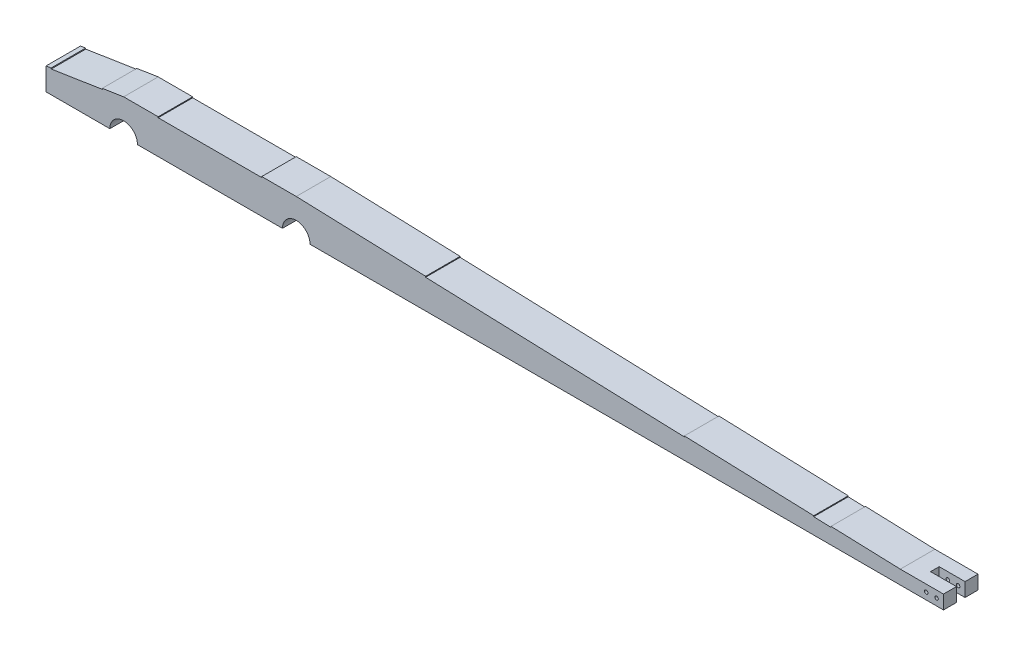
ISO-10303-21;
HEADER;
FILE_DESCRIPTION(('STEP AP214'),'2;1');
FILE_NAME('part.step','',(''),(''),'','','');
FILE_SCHEMA(('AUTOMOTIVE_DESIGN { 1 0 10303 214 1 1 1 1 }'));
ENDSEC;
DATA;
#1=APPLICATION_CONTEXT('core data for automotive mechanical design processes');
#2=APPLICATION_PROTOCOL_DEFINITION('international standard','automotive_design',2000,#1);
#3=PRODUCT_CONTEXT('',#1,'mechanical');
#4=PRODUCT('Part','Part','',(#3));
#5=PRODUCT_RELATED_PRODUCT_CATEGORY('part','',(#4));
#6=PRODUCT_DEFINITION_FORMATION('','',#4);
#7=PRODUCT_DEFINITION_CONTEXT('part definition',#1,'design');
#8=PRODUCT_DEFINITION('design','',#6,#7);
#9=PRODUCT_DEFINITION_SHAPE('','',#8);
#10=(LENGTH_UNIT() NAMED_UNIT(*) SI_UNIT(.MILLI.,.METRE.));
#11=(NAMED_UNIT(*) PLANE_ANGLE_UNIT() SI_UNIT($,.RADIAN.));
#12=(NAMED_UNIT(*) SI_UNIT($,.STERADIAN.) SOLID_ANGLE_UNIT());
#13=UNCERTAINTY_MEASURE_WITH_UNIT(LENGTH_MEASURE(1.E-05),#10,'distance_accuracy_value','');
#14=(GEOMETRIC_REPRESENTATION_CONTEXT(3) GLOBAL_UNCERTAINTY_ASSIGNED_CONTEXT((#13)) GLOBAL_UNIT_ASSIGNED_CONTEXT((#10,
#11,#12)) REPRESENTATION_CONTEXT('',''));
#15=CARTESIAN_POINT('',(0.,0.,0.));
#16=DIRECTION('',(0.,0.,1.));
#17=DIRECTION('',(1.,0.,0.));
#18=AXIS2_PLACEMENT_3D('',#15,#16,#17);
#19=CARTESIAN_POINT('',(375.,8.00000000000001,20.));
#20=DIRECTION('',(-1.,0.,0.));
#21=DIRECTION('',(0.,0.,1.));
#22=AXIS2_PLACEMENT_3D('',#19,#20,#21);
#23=PLANE('',#22);
#24=DIRECTION('',(0.,0.,-1.));
#25=VECTOR('',#24,1.);
#26=CARTESIAN_POINT('',(375.,0.,20.));
#27=LINE('',#26,#25);
#28=CARTESIAN_POINT('',(375.,0.,20.));
#29=VERTEX_POINT('',#28);
#30=CARTESIAN_POINT('',(375.,0.,12.5));
#31=VERTEX_POINT('',#30);
#32=EDGE_CURVE('E44',#29,#31,#27,.T.);
#33=ORIENTED_EDGE('',*,*,#32,.T.);
#34=DIRECTION('',(0.,1.,0.));
#35=VECTOR('',#34,1.);
#36=CARTESIAN_POINT('',(375.,0.,12.5));
#37=LINE('',#36,#35);
#38=CARTESIAN_POINT('',(375.,8.00000000000001,12.5));
#39=VERTEX_POINT('',#38);
#40=EDGE_CURVE('E302',#31,#39,#37,.T.);
#41=ORIENTED_EDGE('',*,*,#40,.T.);
#42=DIRECTION('',(0.,0.,-1.));
#43=VECTOR('',#42,1.);
#44=CARTESIAN_POINT('',(375.,8.00000000000001,20.));
#45=LINE('',#44,#43);
#46=CARTESIAN_POINT('',(375.,8.00000000000001,20.));
#47=VERTEX_POINT('',#46);
#48=EDGE_CURVE('E262',#47,#39,#45,.T.);
#49=ORIENTED_EDGE('',*,*,#48,.F.);
#50=DIRECTION('',(0.,1.,0.));
#51=VECTOR('',#50,1.);
#52=CARTESIAN_POINT('',(375.,8.00000000000001,20.));
#53=LINE('',#52,#51);
#54=EDGE_CURVE('E412',#29,#47,#53,.T.);
#55=ORIENTED_EDGE('',*,*,#54,.F.);
#56=EDGE_LOOP('',(#33,#41,#49,#55));
#57=FACE_BOUND('',#56,.T.);
#58=ADVANCED_FACE('F35',(#57),#23,.F.);
#59=CARTESIAN_POINT('',(-100.,20.,20.));
#60=DIRECTION('',(0.153707006281871,-0.988116468954882,0.));
#61=DIRECTION('',(0.988116468954882,0.153707006281871,0.));
#62=AXIS2_PLACEMENT_3D('',#59,#60,#61);
#63=PLANE('',#62);
#64=DIRECTION('',(-0.988116468954882,-0.153707006281871,0.));
#65=VECTOR('',#64,1.);
#66=CARTESIAN_POINT('',(-100.,20.,20.));
#67=LINE('',#66,#65);
#68=CARTESIAN_POINT('',(-142.035650593135,13.4611210188456,20.));
#69=VERTEX_POINT('',#68);
#70=CARTESIAN_POINT('',(-145.,13.,20.));
#71=VERTEX_POINT('',#70);
#72=EDGE_CURVE('E425',#69,#71,#67,.T.);
#73=ORIENTED_EDGE('',*,*,#72,.F.);
#74=DIRECTION('',(0.,0.,1.));
#75=VECTOR('',#74,1.);
#76=CARTESIAN_POINT('',(-142.035650593135,13.4611210188456,0.));
#77=LINE('',#76,#75);
#78=CARTESIAN_POINT('',(-142.035650593135,13.4611210188456,0.));
#79=VERTEX_POINT('',#78);
#80=EDGE_CURVE('E305',#79,#69,#77,.T.);
#81=ORIENTED_EDGE('',*,*,#80,.F.);
#82=DIRECTION('',(-0.988116468954882,-0.153707006281871,0.));
#83=VECTOR('',#82,1.);
#84=CARTESIAN_POINT('',(-100.,20.,0.));
#85=LINE('',#84,#83);
#86=CARTESIAN_POINT('',(-145.,13.,0.));
#87=VERTEX_POINT('',#86);
#88=EDGE_CURVE('E454',#79,#87,#85,.T.);
#89=ORIENTED_EDGE('',*,*,#88,.T.);
#90=DIRECTION('',(0.,0.,-1.));
#91=VECTOR('',#90,1.);
#92=CARTESIAN_POINT('',(-145.,13.,20.));
#93=LINE('',#92,#91);
#94=EDGE_CURVE('E476',#71,#87,#93,.T.);
#95=ORIENTED_EDGE('',*,*,#94,.F.);
#96=EDGE_LOOP('',(#73,#81,#89,#95));
#97=FACE_BOUND('',#96,.T.);
#98=ADVANCED_FACE('F530',(#97),#63,.F.);
#99=CARTESIAN_POINT('',(-100.,20.,20.));
#100=DIRECTION('',(0.,-1.,0.));
#101=DIRECTION('',(0.,0.,-1.));
#102=AXIS2_PLACEMENT_3D('',#99,#100,#101);
#103=PLANE('',#102);
#104=DIRECTION('',(-1.,0.,0.));
#105=VECTOR('',#104,1.);
#106=CARTESIAN_POINT('',(-100.,20.,20.));
#107=LINE('',#106,#105);
#108=CARTESIAN_POINT('',(-80.,20.,20.));
#109=VERTEX_POINT('',#108);
#110=CARTESIAN_POINT('',(-100.,20.,20.));
#111=VERTEX_POINT('',#110);
#112=EDGE_CURVE('E420',#109,#111,#107,.T.);
#113=ORIENTED_EDGE('',*,*,#112,.F.);
#114=DIRECTION('',(0.,0.,1.));
#115=VECTOR('',#114,1.);
#116=CARTESIAN_POINT('',(-80.,20.,0.));
#117=LINE('',#116,#115);
#118=CARTESIAN_POINT('',(-80.,20.,0.));
#119=VERTEX_POINT('',#118);
#120=EDGE_CURVE('E323',#119,#109,#117,.T.);
#121=ORIENTED_EDGE('',*,*,#120,.F.);
#122=DIRECTION('',(-1.,0.,0.));
#123=VECTOR('',#122,1.);
#124=CARTESIAN_POINT('',(-100.,20.,0.));
#125=LINE('',#124,#123);
#126=CARTESIAN_POINT('',(-100.,20.,0.));
#127=VERTEX_POINT('',#126);
#128=EDGE_CURVE('E449',#119,#127,#125,.T.);
#129=ORIENTED_EDGE('',*,*,#128,.T.);
#130=DIRECTION('',(0.,0.,-1.));
#131=VECTOR('',#130,1.);
#132=CARTESIAN_POINT('',(-100.,20.,20.));
#133=LINE('',#132,#131);
#134=EDGE_CURVE('E479',#111,#127,#133,.T.);
#135=ORIENTED_EDGE('',*,*,#134,.F.);
#136=EDGE_LOOP('',(#113,#121,#129,#135));
#137=FACE_BOUND('',#136,.T.);
#138=ADVANCED_FACE('F535',(#137),#103,.F.);
#139=CARTESIAN_POINT('',(0.,20.,20.));
#140=DIRECTION('',(-0.0342655804311415,-0.999412762574962,0.));
#141=DIRECTION('',(0.999412762574962,-0.0342655804311415,0.));
#142=AXIS2_PLACEMENT_3D('',#139,#140,#141);
#143=PLANE('',#142);
#144=DIRECTION('',(-0.999412762574962,0.0342655804311415,0.));
#145=VECTOR('',#144,1.);
#146=CARTESIAN_POINT('',(0.,20.,20.));
#147=LINE('',#146,#145);
#148=CARTESIAN_POINT('',(74.9559571931221,17.4300814676644,20.));
#149=VERTEX_POINT('',#148);
#150=CARTESIAN_POINT('',(0.,20.,20.));
#151=VERTEX_POINT('',#150);
#152=EDGE_CURVE('E416',#149,#151,#147,.T.);
#153=ORIENTED_EDGE('',*,*,#152,.F.);
#154=DIRECTION('',(0.,0.,1.));
#155=VECTOR('',#154,1.);
#156=CARTESIAN_POINT('',(74.9559571931221,17.4300814676644,0.));
#157=LINE('',#156,#155);
#158=CARTESIAN_POINT('',(74.9559571931221,17.4300814676644,0.));
#159=VERTEX_POINT('',#158);
#160=EDGE_CURVE('E369',#159,#149,#157,.T.);
#161=ORIENTED_EDGE('',*,*,#160,.F.);
#162=DIRECTION('',(-0.999412762574962,0.0342655804311415,0.));
#163=VECTOR('',#162,1.);
#164=CARTESIAN_POINT('',(0.,20.,0.));
#165=LINE('',#164,#163);
#166=CARTESIAN_POINT('',(0.,20.,0.));
#167=VERTEX_POINT('',#166);
#168=EDGE_CURVE('E445',#159,#167,#165,.T.);
#169=ORIENTED_EDGE('',*,*,#168,.T.);
#170=DIRECTION('',(0.,0.,-1.));
#171=VECTOR('',#170,1.);
#172=CARTESIAN_POINT('',(0.,20.,20.));
#173=LINE('',#172,#171);
#174=EDGE_CURVE('E482',#151,#167,#173,.T.);
#175=ORIENTED_EDGE('',*,*,#174,.F.);
#176=EDGE_LOOP('',(#153,#161,#169,#175));
#177=FACE_BOUND('',#176,.T.);
#178=ADVANCED_FACE('F553',(#177),#143,.F.);
#179=CARTESIAN_POINT('',(299.823828772489,9.72032587065754,0.));
#180=VERTEX_POINT('',#179);
#181=CARTESIAN_POINT('',(224.867871579366,12.2902444029932,0.));
#182=VERTEX_POINT('',#181);
#183=EDGE_CURVE('E450',#180,#182,#165,.T.);
#184=ORIENTED_EDGE('',*,*,#183,.T.);
#185=DIRECTION('',(0.,0.,-1.));
#186=VECTOR('',#185,1.);
#187=CARTESIAN_POINT('',(224.867871579366,12.2902444029932,0.));
#188=LINE('',#187,#186);
#189=CARTESIAN_POINT('',(224.867871579366,12.2902444029932,20.));
#190=VERTEX_POINT('',#189);
#191=EDGE_CURVE('E360',#190,#182,#188,.T.);
#192=ORIENTED_EDGE('',*,*,#191,.F.);
#193=CARTESIAN_POINT('',(299.823828772489,9.72032587065754,20.));
#194=VERTEX_POINT('',#193);
#195=EDGE_CURVE('E421',#194,#190,#147,.T.);
#196=ORIENTED_EDGE('',*,*,#195,.F.);
#197=DIRECTION('',(0.,0.,1.));
#198=VECTOR('',#197,1.);
#199=CARTESIAN_POINT('',(299.823828772489,9.72032587065754,0.));
#200=LINE('',#199,#198);
#201=EDGE_CURVE('E348',#180,#194,#200,.T.);
#202=ORIENTED_EDGE('',*,*,#201,.F.);
#203=EDGE_LOOP('',(#184,#192,#196,#202));
#204=FACE_BOUND('',#203,.T.);
#205=ADVANCED_FACE('F548',(#204),#143,.F.);
#206=CARTESIAN_POINT('',(0.,0.,20.));
#207=DIRECTION('',(0.,0.,-1.));
#208=DIRECTION('',(-1.,0.,0.));
#209=AXIS2_PLACEMENT_3D('',#206,#207,#208);
#210=CYLINDRICAL_SURFACE('',#209,8.);
#211=CARTESIAN_POINT('',(0.,0.,0.));
#212=DIRECTION('',(0.,0.,-1.));
#213=DIRECTION('',(1.,0.,0.));
#214=AXIS2_PLACEMENT_3D('',#211,#212,#213);
#215=CIRCLE('',#214,8.);
#216=CARTESIAN_POINT('',(-8.,0.,0.));
#217=VERTEX_POINT('',#216);
#218=CARTESIAN_POINT('',(8.,0.,0.));
#219=VERTEX_POINT('',#218);
#220=EDGE_CURVE('E375',#217,#219,#215,.T.);
#221=ORIENTED_EDGE('',*,*,#220,.T.);
#222=DIRECTION('',(0.,0.,-1.));
#223=VECTOR('',#222,1.);
#224=CARTESIAN_POINT('',(8.,0.,20.));
#225=LINE('',#224,#223);
#226=CARTESIAN_POINT('',(8.,0.,20.));
#227=VERTEX_POINT('',#226);
#228=EDGE_CURVE('E11',#227,#219,#225,.T.);
#229=ORIENTED_EDGE('',*,*,#228,.F.);
#230=CARTESIAN_POINT('',(0.,0.,20.));
#231=DIRECTION('',(0.,0.,-1.));
#232=DIRECTION('',(1.,0.,0.));
#233=AXIS2_PLACEMENT_3D('',#230,#231,#232);
#234=CIRCLE('',#233,8.);
#235=CARTESIAN_POINT('',(-8.,0.,20.));
#236=VERTEX_POINT('',#235);
#237=EDGE_CURVE('E406',#236,#227,#234,.T.);
#238=ORIENTED_EDGE('',*,*,#237,.F.);
#239=DIRECTION('',(0.,0.,-1.));
#240=VECTOR('',#239,1.);
#241=CARTESIAN_POINT('',(-8.,0.,20.));
#242=LINE('',#241,#240);
#243=EDGE_CURVE('E437',#236,#217,#242,.T.);
#244=ORIENTED_EDGE('',*,*,#243,.T.);
#245=EDGE_LOOP('',(#221,#229,#238,#244));
#246=FACE_BOUND('',#245,.T.);
#247=ADVANCED_FACE('F37',(#246),#210,.F.);
#248=CARTESIAN_POINT('',(8.,0.,20.));
#249=DIRECTION('',(0.,1.,0.));
#250=DIRECTION('',(-1.,0.,0.));
#251=AXIS2_PLACEMENT_3D('',#248,#249,#250);
#252=PLANE('',#251);
#253=DIRECTION('',(0.,0.,1.));
#254=VECTOR('',#253,1.);
#255=CARTESIAN_POINT('',(360.,0.,12.5));
#256=LINE('',#255,#254);
#257=CARTESIAN_POINT('',(360.,0.,7.5));
#258=VERTEX_POINT('',#257);
#259=CARTESIAN_POINT('',(360.,0.,12.5));
#260=VERTEX_POINT('',#259);
#261=EDGE_CURVE('E247',#258,#260,#256,.T.);
#262=ORIENTED_EDGE('',*,*,#261,.T.);
#263=DIRECTION('',(1.,0.,0.));
#264=VECTOR('',#263,1.);
#265=CARTESIAN_POINT('',(360.,0.,12.5));
#266=LINE('',#265,#264);
#267=EDGE_CURVE('E257',#260,#31,#266,.T.);
#268=ORIENTED_EDGE('',*,*,#267,.T.);
#269=ORIENTED_EDGE('',*,*,#32,.F.);
#270=DIRECTION('',(1.,0.,0.));
#271=VECTOR('',#270,1.);
#272=CARTESIAN_POINT('',(8.,0.,20.));
#273=LINE('',#272,#271);
#274=EDGE_CURVE('E409',#227,#29,#273,.T.);
#275=ORIENTED_EDGE('',*,*,#274,.F.);
#276=ORIENTED_EDGE('',*,*,#228,.T.);
#277=DIRECTION('',(1.,0.,0.));
#278=VECTOR('',#277,1.);
#279=CARTESIAN_POINT('',(8.,0.,0.));
#280=LINE('',#279,#278);
#281=CARTESIAN_POINT('',(375.,0.,0.));
#282=VERTEX_POINT('',#281);
#283=EDGE_CURVE('E260',#219,#282,#280,.T.);
#284=ORIENTED_EDGE('',*,*,#283,.T.);
#285=CARTESIAN_POINT('',(375.,0.,7.5));
#286=VERTEX_POINT('',#285);
#287=EDGE_CURVE('E254',#286,#282,#27,.T.);
#288=ORIENTED_EDGE('',*,*,#287,.F.);
#289=DIRECTION('',(-1.,0.,0.));
#290=VECTOR('',#289,1.);
#291=CARTESIAN_POINT('',(360.,0.,7.5));
#292=LINE('',#291,#290);
#293=EDGE_CURVE('E240',#286,#258,#292,.T.);
#294=ORIENTED_EDGE('',*,*,#293,.T.);
#295=EDGE_LOOP('',(#262,#268,#269,#275,#276,#284,#288,#294));
#296=FACE_BOUND('',#295,.T.);
#297=ADVANCED_FACE('F259',(#296),#252,.F.);
#298=CARTESIAN_POINT('',(375.,8.00000000000001,7.5));
#299=VERTEX_POINT('',#298);
#300=CARTESIAN_POINT('',(375.,8.00000000000001,0.));
#301=VERTEX_POINT('',#300);
#302=EDGE_CURVE('E256',#299,#301,#45,.T.);
#303=ORIENTED_EDGE('',*,*,#302,.F.);
#304=DIRECTION('',(0.,1.,0.));
#305=VECTOR('',#304,1.);
#306=CARTESIAN_POINT('',(375.,0.,7.5));
#307=LINE('',#306,#305);
#308=EDGE_CURVE('E52',#286,#299,#307,.T.);
#309=ORIENTED_EDGE('',*,*,#308,.F.);
#310=ORIENTED_EDGE('',*,*,#287,.T.);
#311=DIRECTION('',(0.,1.,0.));
#312=VECTOR('',#311,1.);
#313=CARTESIAN_POINT('',(375.,8.00000000000001,0.));
#314=LINE('',#313,#312);
#315=EDGE_CURVE('E441',#282,#301,#314,.T.);
#316=ORIENTED_EDGE('',*,*,#315,.T.);
#317=EDGE_LOOP('',(#303,#309,#310,#316));
#318=FACE_BOUND('',#317,.T.);
#319=ADVANCED_FACE('F252',(#318),#23,.F.);
#320=CARTESIAN_POINT('',(350.,8.,20.));
#321=DIRECTION('',(0.,-1.,0.));
#322=DIRECTION('',(1.,0.,0.));
#323=AXIS2_PLACEMENT_3D('',#320,#321,#322);
#324=PLANE('',#323);
#325=ORIENTED_EDGE('',*,*,#48,.T.);
#326=DIRECTION('',(1.,0.,0.));
#327=VECTOR('',#326,1.);
#328=CARTESIAN_POINT('',(360.,8.,12.5));
#329=LINE('',#328,#327);
#330=CARTESIAN_POINT('',(360.,8.,12.5));
#331=VERTEX_POINT('',#330);
#332=EDGE_CURVE('E248',#331,#39,#329,.T.);
#333=ORIENTED_EDGE('',*,*,#332,.F.);
#334=DIRECTION('',(0.,0.,1.));
#335=VECTOR('',#334,1.);
#336=CARTESIAN_POINT('',(360.,8.,12.5));
#337=LINE('',#336,#335);
#338=CARTESIAN_POINT('',(360.,8.,7.5));
#339=VERTEX_POINT('',#338);
#340=EDGE_CURVE('E298',#339,#331,#337,.T.);
#341=ORIENTED_EDGE('',*,*,#340,.F.);
#342=DIRECTION('',(-1.,0.,0.));
#343=VECTOR('',#342,1.);
#344=CARTESIAN_POINT('',(360.,8.,7.5));
#345=LINE('',#344,#343);
#346=EDGE_CURVE('E292',#299,#339,#345,.T.);
#347=ORIENTED_EDGE('',*,*,#346,.F.);
#348=ORIENTED_EDGE('',*,*,#302,.T.);
#349=DIRECTION('',(-1.,0.,0.));
#350=VECTOR('',#349,1.);
#351=CARTESIAN_POINT('',(350.,8.,0.));
#352=LINE('',#351,#350);
#353=CARTESIAN_POINT('',(350.,8.,0.));
#354=VERTEX_POINT('',#353);
#355=EDGE_CURVE('E443',#301,#354,#352,.T.);
#356=ORIENTED_EDGE('',*,*,#355,.T.);
#357=DIRECTION('',(0.,0.,-1.));
#358=VECTOR('',#357,1.);
#359=CARTESIAN_POINT('',(350.,8.,20.));
#360=LINE('',#359,#358);
#361=CARTESIAN_POINT('',(350.,8.,20.));
#362=VERTEX_POINT('',#361);
#363=EDGE_CURVE('E484',#362,#354,#360,.T.);
#364=ORIENTED_EDGE('',*,*,#363,.F.);
#365=DIRECTION('',(-1.,0.,0.));
#366=VECTOR('',#365,1.);
#367=CARTESIAN_POINT('',(350.,8.,20.));
#368=LINE('',#367,#366);
#369=EDGE_CURVE('E414',#47,#362,#368,.T.);
#370=ORIENTED_EDGE('',*,*,#369,.F.);
#371=EDGE_LOOP('',(#325,#333,#341,#347,#348,#356,#364,#370));
#372=FACE_BOUND('',#371,.T.);
#373=ADVANCED_FACE('F491',(#372),#324,.F.);
#374=CARTESIAN_POINT('',(309.817956398238,9.37767006634613,0.));
#375=VERTEX_POINT('',#374);
#376=EDGE_CURVE('E446',#354,#375,#165,.T.);
#377=ORIENTED_EDGE('',*,*,#376,.T.);
#378=DIRECTION('',(0.,0.,-1.));
#379=VECTOR('',#378,1.);
#380=CARTESIAN_POINT('',(309.817956398238,9.37767006634613,0.));
#381=LINE('',#380,#379);
#382=CARTESIAN_POINT('',(309.817956398238,9.37767006634613,20.));
#383=VERTEX_POINT('',#382);
#384=EDGE_CURVE('E387',#383,#375,#381,.T.);
#385=ORIENTED_EDGE('',*,*,#384,.F.);
#386=EDGE_CURVE('E417',#362,#383,#147,.T.);
#387=ORIENTED_EDGE('',*,*,#386,.F.);
#388=ORIENTED_EDGE('',*,*,#363,.T.);
#389=EDGE_LOOP('',(#377,#385,#387,#388));
#390=FACE_BOUND('',#389,.T.);
#391=ADVANCED_FACE('F500',(#390),#143,.F.);
#392=CARTESIAN_POINT('',(-20.,20.,0.));
#393=VERTEX_POINT('',#392);
#394=EDGE_CURVE('E451',#167,#393,#125,.T.);
#395=ORIENTED_EDGE('',*,*,#394,.T.);
#396=DIRECTION('',(0.,0.,-1.));
#397=VECTOR('',#396,1.);
#398=CARTESIAN_POINT('',(-20.,20.,0.));
#399=LINE('',#398,#397);
#400=CARTESIAN_POINT('',(-20.,20.,20.));
#401=VERTEX_POINT('',#400);
#402=EDGE_CURVE('E335',#401,#393,#399,.T.);
#403=ORIENTED_EDGE('',*,*,#402,.F.);
#404=EDGE_CURVE('E422',#151,#401,#107,.T.);
#405=ORIENTED_EDGE('',*,*,#404,.F.);
#406=ORIENTED_EDGE('',*,*,#174,.T.);
#407=EDGE_LOOP('',(#395,#403,#405,#406));
#408=FACE_BOUND('',#407,.T.);
#409=ADVANCED_FACE('F647',(#408),#103,.F.);
#410=CARTESIAN_POINT('',(-112.392156524489,18.0723312073017,0.));
#411=VERTEX_POINT('',#410);
#412=EDGE_CURVE('E455',#127,#411,#85,.T.);
#413=ORIENTED_EDGE('',*,*,#412,.T.);
#414=DIRECTION('',(0.,0.,-1.));
#415=VECTOR('',#414,1.);
#416=CARTESIAN_POINT('',(-112.392156524489,18.0723312073017,0.));
#417=LINE('',#416,#415);
#418=CARTESIAN_POINT('',(-112.392156524489,18.0723312073017,20.));
#419=VERTEX_POINT('',#418);
#420=EDGE_CURVE('E313',#419,#411,#417,.T.);
#421=ORIENTED_EDGE('',*,*,#420,.F.);
#422=EDGE_CURVE('E426',#111,#419,#67,.T.);
#423=ORIENTED_EDGE('',*,*,#422,.F.);
#424=ORIENTED_EDGE('',*,*,#134,.T.);
#425=EDGE_LOOP('',(#413,#421,#423,#424));
#426=FACE_BOUND('',#425,.T.);
#427=ADVANCED_FACE('F538',(#426),#63,.F.);
#428=CARTESIAN_POINT('',(-145.,0.,20.));
#429=DIRECTION('',(1.,0.,0.));
#430=DIRECTION('',(0.,0.,-1.));
#431=AXIS2_PLACEMENT_3D('',#428,#429,#430);
#432=PLANE('',#431);
#433=DIRECTION('',(0.,-1.,0.));
#434=VECTOR('',#433,1.);
#435=CARTESIAN_POINT('',(-145.,0.,0.));
#436=LINE('',#435,#434);
#437=CARTESIAN_POINT('',(-145.,0.,0.));
#438=VERTEX_POINT('',#437);
#439=EDGE_CURVE('E458',#87,#438,#436,.T.);
#440=ORIENTED_EDGE('',*,*,#439,.T.);
#441=DIRECTION('',(0.,0.,-1.));
#442=VECTOR('',#441,1.);
#443=CARTESIAN_POINT('',(-145.,0.,20.));
#444=LINE('',#443,#442);
#445=CARTESIAN_POINT('',(-145.,0.,20.));
#446=VERTEX_POINT('',#445);
#447=EDGE_CURVE('E473',#446,#438,#444,.T.);
#448=ORIENTED_EDGE('',*,*,#447,.F.);
#449=DIRECTION('',(0.,-1.,0.));
#450=VECTOR('',#449,1.);
#451=CARTESIAN_POINT('',(-145.,0.,20.));
#452=LINE('',#451,#450);
#453=EDGE_CURVE('E429',#71,#446,#452,.T.);
#454=ORIENTED_EDGE('',*,*,#453,.F.);
#455=ORIENTED_EDGE('',*,*,#94,.T.);
#456=EDGE_LOOP('',(#440,#448,#454,#455));
#457=FACE_BOUND('',#456,.T.);
#458=ADVANCED_FACE('F578',(#457),#432,.F.);
#459=CARTESIAN_POINT('',(-108.,0.,20.));
#460=DIRECTION('',(0.,1.,0.));
#461=DIRECTION('',(-1.,0.,0.));
#462=AXIS2_PLACEMENT_3D('',#459,#460,#461);
#463=PLANE('',#462);
#464=DIRECTION('',(1.,0.,0.));
#465=VECTOR('',#464,1.);
#466=CARTESIAN_POINT('',(-108.,0.,0.));
#467=LINE('',#466,#465);
#468=CARTESIAN_POINT('',(-108.,0.,0.));
#469=VERTEX_POINT('',#468);
#470=EDGE_CURVE('E460',#438,#469,#467,.T.);
#471=ORIENTED_EDGE('',*,*,#470,.T.);
#472=DIRECTION('',(0.,0.,-1.));
#473=VECTOR('',#472,1.);
#474=CARTESIAN_POINT('',(-108.,0.,20.));
#475=LINE('',#474,#473);
#476=CARTESIAN_POINT('',(-108.,0.,20.));
#477=VERTEX_POINT('',#476);
#478=EDGE_CURVE('E470',#477,#469,#475,.T.);
#479=ORIENTED_EDGE('',*,*,#478,.F.);
#480=DIRECTION('',(1.,0.,0.));
#481=VECTOR('',#480,1.);
#482=CARTESIAN_POINT('',(-108.,0.,20.));
#483=LINE('',#482,#481);
#484=EDGE_CURVE('E431',#446,#477,#483,.T.);
#485=ORIENTED_EDGE('',*,*,#484,.F.);
#486=ORIENTED_EDGE('',*,*,#447,.T.);
#487=EDGE_LOOP('',(#471,#479,#485,#486));
#488=FACE_BOUND('',#487,.T.);
#489=ADVANCED_FACE('F573',(#488),#463,.F.);
#490=CARTESIAN_POINT('',(-100.,0.,20.));
#491=DIRECTION('',(0.,0.,-1.));
#492=DIRECTION('',(-1.,0.,0.));
#493=AXIS2_PLACEMENT_3D('',#490,#491,#492);
#494=CYLINDRICAL_SURFACE('',#493,8.00000000000001);
#495=CARTESIAN_POINT('',(-100.,0.,0.));
#496=DIRECTION('',(0.,0.,-1.));
#497=DIRECTION('',(1.,0.,0.));
#498=AXIS2_PLACEMENT_3D('',#495,#496,#497);
#499=CIRCLE('',#498,8.00000000000001);
#500=CARTESIAN_POINT('',(-92.,0.,0.));
#501=VERTEX_POINT('',#500);
#502=EDGE_CURVE('E462',#469,#501,#499,.T.);
#503=ORIENTED_EDGE('',*,*,#502,.T.);
#504=DIRECTION('',(0.,0.,-1.));
#505=VECTOR('',#504,1.);
#506=CARTESIAN_POINT('',(-92.,0.,20.));
#507=LINE('',#506,#505);
#508=CARTESIAN_POINT('',(-92.,0.,20.));
#509=VERTEX_POINT('',#508);
#510=EDGE_CURVE('E467',#509,#501,#507,.T.);
#511=ORIENTED_EDGE('',*,*,#510,.F.);
#512=CARTESIAN_POINT('',(-100.,0.,20.));
#513=DIRECTION('',(0.,0.,-1.));
#514=DIRECTION('',(1.,0.,0.));
#515=AXIS2_PLACEMENT_3D('',#512,#513,#514);
#516=CIRCLE('',#515,8.00000000000001);
#517=EDGE_CURVE('E433',#477,#509,#516,.T.);
#518=ORIENTED_EDGE('',*,*,#517,.F.);
#519=ORIENTED_EDGE('',*,*,#478,.T.);
#520=EDGE_LOOP('',(#503,#511,#518,#519));
#521=FACE_BOUND('',#520,.T.);
#522=ADVANCED_FACE('F568',(#521),#494,.F.);
#523=CARTESIAN_POINT('',(-8.,0.,20.));
#524=DIRECTION('',(0.,1.,0.));
#525=DIRECTION('',(-1.,0.,0.));
#526=AXIS2_PLACEMENT_3D('',#523,#524,#525);
#527=PLANE('',#526);
#528=DIRECTION('',(1.,0.,0.));
#529=VECTOR('',#528,1.);
#530=CARTESIAN_POINT('',(-8.,0.,0.));
#531=LINE('',#530,#529);
#532=EDGE_CURVE('E410',#501,#217,#531,.T.);
#533=ORIENTED_EDGE('',*,*,#532,.T.);
#534=ORIENTED_EDGE('',*,*,#243,.F.);
#535=DIRECTION('',(1.,0.,0.));
#536=VECTOR('',#535,1.);
#537=CARTESIAN_POINT('',(-8.,0.,20.));
#538=LINE('',#537,#536);
#539=EDGE_CURVE('E435',#509,#236,#538,.T.);
#540=ORIENTED_EDGE('',*,*,#539,.F.);
#541=ORIENTED_EDGE('',*,*,#510,.T.);
#542=EDGE_LOOP('',(#533,#534,#540,#541));
#543=FACE_BOUND('',#542,.T.);
#544=ADVANCED_FACE('F566',(#543),#527,.F.);
#545=CARTESIAN_POINT('',(0.,0.,20.));
#546=DIRECTION('',(0.,0.,1.));
#547=DIRECTION('',(1.,0.,0.));
#548=AXIS2_PLACEMENT_3D('',#545,#546,#547);
#549=PLANE('',#548);
#550=CARTESIAN_POINT('',(365.,4.,20.));
#551=DIRECTION('',(0.,0.,1.));
#552=DIRECTION('',(1.,0.,0.));
#553=AXIS2_PLACEMENT_3D('',#550,#551,#552);
#554=CIRCLE('',#553,0.999999999999998);
#555=CARTESIAN_POINT('',(366.,4.,20.));
#556=VERTEX_POINT('',#555);
#557=EDGE_CURVE('E277',#556,#556,#554,.T.);
#558=ORIENTED_EDGE('',*,*,#557,.F.);
#559=EDGE_LOOP('',(#558));
#560=FACE_BOUND('',#559,.T.);
#561=CARTESIAN_POINT('',(371.,4.,20.));
#562=DIRECTION('',(0.,0.,1.));
#563=DIRECTION('',(1.,0.,0.));
#564=AXIS2_PLACEMENT_3D('',#561,#562,#563);
#565=CIRCLE('',#564,0.999999999999998);
#566=CARTESIAN_POINT('',(372.,4.,20.));
#567=VERTEX_POINT('',#566);
#568=EDGE_CURVE('E287',#567,#567,#565,.T.);
#569=ORIENTED_EDGE('',*,*,#568,.F.);
#570=EDGE_LOOP('',(#569));
#571=FACE_BOUND('',#570,.T.);
#572=DIRECTION('',(-0.153707006281871,0.988116468954882,0.));
#573=VECTOR('',#572,1.);
#574=CARTESIAN_POINT('',(-141.958797089994,12.9670627843682,20.));
#575=LINE('',#574,#573);
#576=CARTESIAN_POINT('',(-141.958797089994,12.9670627843682,20.));
#577=VERTEX_POINT('',#576);
#578=EDGE_CURVE('E318',#577,#69,#575,.T.);
#579=ORIENTED_EDGE('',*,*,#578,.T.);
#580=ORIENTED_EDGE('',*,*,#72,.T.);
#581=ORIENTED_EDGE('',*,*,#453,.T.);
#582=ORIENTED_EDGE('',*,*,#484,.T.);
#583=ORIENTED_EDGE('',*,*,#517,.T.);
#584=ORIENTED_EDGE('',*,*,#539,.T.);
#585=ORIENTED_EDGE('',*,*,#237,.T.);
#586=ORIENTED_EDGE('',*,*,#274,.T.);
#587=ORIENTED_EDGE('',*,*,#54,.T.);
#588=ORIENTED_EDGE('',*,*,#369,.T.);
#589=ORIENTED_EDGE('',*,*,#386,.T.);
#590=DIRECTION('',(0.0342655804311415,0.999412762574962,0.));
#591=VECTOR('',#590,1.);
#592=CARTESIAN_POINT('',(309.800823608023,8.87796368505864,20.));
#593=LINE('',#592,#591);
#594=CARTESIAN_POINT('',(309.800823608023,8.87796368505864,20.));
#595=VERTEX_POINT('',#594);
#596=EDGE_CURVE('E402',#595,#383,#593,.T.);
#597=ORIENTED_EDGE('',*,*,#596,.F.);
#598=DIRECTION('',(0.999412762574962,-0.0342655804311418,0.));
#599=VECTOR('',#598,1.);
#600=CARTESIAN_POINT('',(299.806695982273,9.22061948937006,20.));
#601=LINE('',#600,#599);
#602=CARTESIAN_POINT('',(299.806695982273,9.22061948937006,20.));
#603=VERTEX_POINT('',#602);
#604=EDGE_CURVE('E386',#603,#595,#601,.T.);
#605=ORIENTED_EDGE('',*,*,#604,.F.);
#606=DIRECTION('',(0.0342655804311415,0.999412762574962,0.));
#607=VECTOR('',#606,1.);
#608=CARTESIAN_POINT('',(299.806695982273,9.22061948937006,20.));
#609=LINE('',#608,#607);
#610=EDGE_CURVE('E395',#603,#194,#609,.T.);
#611=ORIENTED_EDGE('',*,*,#610,.T.);
#612=ORIENTED_EDGE('',*,*,#195,.T.);
#613=DIRECTION('',(0.0342655804311415,0.999412762574962,0.));
#614=VECTOR('',#613,1.);
#615=CARTESIAN_POINT('',(224.850738789151,11.7905380217057,20.));
#616=LINE('',#615,#614);
#617=CARTESIAN_POINT('',(224.850738789151,11.7905380217057,20.));
#618=VERTEX_POINT('',#617);
#619=EDGE_CURVE('E379',#618,#190,#616,.T.);
#620=ORIENTED_EDGE('',*,*,#619,.F.);
#621=DIRECTION('',(0.999412762574962,-0.0342655804311415,0.));
#622=VECTOR('',#621,1.);
#623=CARTESIAN_POINT('',(74.9388244029066,16.9303750863769,20.));
#624=LINE('',#623,#622);
#625=CARTESIAN_POINT('',(74.9388244029066,16.9303750863769,20.));
#626=VERTEX_POINT('',#625);
#627=EDGE_CURVE('E359',#626,#618,#624,.T.);
#628=ORIENTED_EDGE('',*,*,#627,.F.);
#629=DIRECTION('',(0.0342655804311415,0.999412762574962,0.));
#630=VECTOR('',#629,1.);
#631=CARTESIAN_POINT('',(74.9388244029066,16.9303750863769,20.));
#632=LINE('',#631,#630);
#633=EDGE_CURVE('E368',#626,#149,#632,.T.);
#634=ORIENTED_EDGE('',*,*,#633,.T.);
#635=ORIENTED_EDGE('',*,*,#152,.T.);
#636=ORIENTED_EDGE('',*,*,#404,.T.);
#637=DIRECTION('',(0.,1.,0.));
#638=VECTOR('',#637,1.);
#639=CARTESIAN_POINT('',(-20.,19.5,20.));
#640=LINE('',#639,#638);
#641=CARTESIAN_POINT('',(-20.,19.5,20.));
#642=VERTEX_POINT('',#641);
#643=EDGE_CURVE('E352',#642,#401,#640,.T.);
#644=ORIENTED_EDGE('',*,*,#643,.F.);
#645=DIRECTION('',(1.,0.,0.));
#646=VECTOR('',#645,1.);
#647=CARTESIAN_POINT('',(-80.,19.5,20.));
#648=LINE('',#647,#646);
#649=CARTESIAN_POINT('',(-80.,19.5,20.));
#650=VERTEX_POINT('',#649);
#651=EDGE_CURVE('E334',#650,#642,#648,.T.);
#652=ORIENTED_EDGE('',*,*,#651,.F.);
#653=DIRECTION('',(0.,1.,0.));
#654=VECTOR('',#653,1.);
#655=CARTESIAN_POINT('',(-80.,19.5,20.));
#656=LINE('',#655,#654);
#657=EDGE_CURVE('E343',#650,#109,#656,.T.);
#658=ORIENTED_EDGE('',*,*,#657,.T.);
#659=ORIENTED_EDGE('',*,*,#112,.T.);
#660=ORIENTED_EDGE('',*,*,#422,.T.);
#661=DIRECTION('',(-0.153707006281871,0.988116468954882,0.));
#662=VECTOR('',#661,1.);
#663=CARTESIAN_POINT('',(-112.315303021348,17.5782729728243,20.));
#664=LINE('',#663,#662);
#665=CARTESIAN_POINT('',(-112.315303021348,17.5782729728243,20.));
#666=VERTEX_POINT('',#665);
#667=EDGE_CURVE('E327',#666,#419,#664,.T.);
#668=ORIENTED_EDGE('',*,*,#667,.F.);
#669=DIRECTION('',(0.988116468954882,0.153707006281871,0.));
#670=VECTOR('',#669,1.);
#671=CARTESIAN_POINT('',(-141.958797089994,12.9670627843682,20.));
#672=LINE('',#671,#670);
#673=EDGE_CURVE('E312',#577,#666,#672,.T.);
#674=ORIENTED_EDGE('',*,*,#673,.F.);
#675=EDGE_LOOP('',(#579,#580,#581,#582,#583,#584,#585,#586,#587,#588,#589,#597,#605,#611,#612,
#620,#628,#634,#635,#636,#644,#652,#658,#659,#660,#668,#674));
#676=FACE_BOUND('',#675,.T.);
#677=ADVANCED_FACE('F504',(#560,#571,#676),#549,.T.);
#678=CARTESIAN_POINT('',(0.,0.,0.));
#679=DIRECTION('',(0.,0.,1.));
#680=DIRECTION('',(1.,0.,0.));
#681=AXIS2_PLACEMENT_3D('',#678,#679,#680);
#682=PLANE('',#681);
#683=CARTESIAN_POINT('',(365.,4.,0.));
#684=DIRECTION('',(0.,0.,1.));
#685=DIRECTION('',(1.,0.,0.));
#686=AXIS2_PLACEMENT_3D('',#683,#684,#685);
#687=CIRCLE('',#686,0.999999999999998);
#688=CARTESIAN_POINT('',(366.,4.,0.));
#689=VERTEX_POINT('',#688);
#690=EDGE_CURVE('E271',#689,#689,#687,.T.);
#691=ORIENTED_EDGE('',*,*,#690,.T.);
#692=EDGE_LOOP('',(#691));
#693=FACE_BOUND('',#692,.T.);
#694=CARTESIAN_POINT('',(371.,4.,0.));
#695=DIRECTION('',(0.,0.,1.));
#696=DIRECTION('',(1.,0.,0.));
#697=AXIS2_PLACEMENT_3D('',#694,#695,#696);
#698=CIRCLE('',#697,0.999999999999998);
#699=CARTESIAN_POINT('',(372.,4.,0.));
#700=VERTEX_POINT('',#699);
#701=EDGE_CURVE('E282',#700,#700,#698,.T.);
#702=ORIENTED_EDGE('',*,*,#701,.T.);
#703=EDGE_LOOP('',(#702));
#704=FACE_BOUND('',#703,.T.);
#705=ORIENTED_EDGE('',*,*,#88,.F.);
#706=DIRECTION('',(-0.153707006281871,0.988116468954882,0.));
#707=VECTOR('',#706,1.);
#708=CARTESIAN_POINT('',(-141.958797089994,12.9670627843682,0.));
#709=LINE('',#708,#707);
#710=CARTESIAN_POINT('',(-141.958797089994,12.9670627843682,0.));
#711=VERTEX_POINT('',#710);
#712=EDGE_CURVE('E321',#711,#79,#709,.T.);
#713=ORIENTED_EDGE('',*,*,#712,.F.);
#714=DIRECTION('',(-0.988116468954882,-0.153707006281871,0.));
#715=VECTOR('',#714,1.);
#716=CARTESIAN_POINT('',(-141.958797089994,12.9670627843682,0.));
#717=LINE('',#716,#715);
#718=CARTESIAN_POINT('',(-112.315303021348,17.5782729728243,0.));
#719=VERTEX_POINT('',#718);
#720=EDGE_CURVE('E316',#719,#711,#717,.T.);
#721=ORIENTED_EDGE('',*,*,#720,.F.);
#722=DIRECTION('',(-0.153707006281871,0.988116468954882,0.));
#723=VECTOR('',#722,1.);
#724=CARTESIAN_POINT('',(-112.315303021348,17.5782729728243,0.));
#725=LINE('',#724,#723);
#726=EDGE_CURVE('E324',#719,#411,#725,.T.);
#727=ORIENTED_EDGE('',*,*,#726,.T.);
#728=ORIENTED_EDGE('',*,*,#412,.F.);
#729=ORIENTED_EDGE('',*,*,#128,.F.);
#730=DIRECTION('',(0.,1.,0.));
#731=VECTOR('',#730,1.);
#732=CARTESIAN_POINT('',(-80.,19.5,0.));
#733=LINE('',#732,#731);
#734=CARTESIAN_POINT('',(-80.,19.5,0.));
#735=VERTEX_POINT('',#734);
#736=EDGE_CURVE('E346',#735,#119,#733,.T.);
#737=ORIENTED_EDGE('',*,*,#736,.F.);
#738=DIRECTION('',(-1.,0.,0.));
#739=VECTOR('',#738,1.);
#740=CARTESIAN_POINT('',(-80.,19.5,0.));
#741=LINE('',#740,#739);
#742=CARTESIAN_POINT('',(-20.,19.5,0.));
#743=VERTEX_POINT('',#742);
#744=EDGE_CURVE('E340',#743,#735,#741,.T.);
#745=ORIENTED_EDGE('',*,*,#744,.F.);
#746=DIRECTION('',(0.,1.,0.));
#747=VECTOR('',#746,1.);
#748=CARTESIAN_POINT('',(-20.,19.5,0.));
#749=LINE('',#748,#747);
#750=EDGE_CURVE('E349',#743,#393,#749,.T.);
#751=ORIENTED_EDGE('',*,*,#750,.T.);
#752=ORIENTED_EDGE('',*,*,#394,.F.);
#753=ORIENTED_EDGE('',*,*,#168,.F.);
#754=DIRECTION('',(0.0342655804311415,0.999412762574962,0.));
#755=VECTOR('',#754,1.);
#756=CARTESIAN_POINT('',(74.9388244029066,16.9303750863769,0.));
#757=LINE('',#756,#755);
#758=CARTESIAN_POINT('',(74.9388244029066,16.9303750863769,0.));
#759=VERTEX_POINT('',#758);
#760=EDGE_CURVE('E373',#759,#159,#757,.T.);
#761=ORIENTED_EDGE('',*,*,#760,.F.);
#762=DIRECTION('',(-0.999412762574962,0.0342655804311415,0.));
#763=VECTOR('',#762,1.);
#764=CARTESIAN_POINT('',(74.9388244029066,16.9303750863769,0.));
#765=LINE('',#764,#763);
#766=CARTESIAN_POINT('',(224.850738789151,11.7905380217057,0.));
#767=VERTEX_POINT('',#766);
#768=EDGE_CURVE('E365',#767,#759,#765,.T.);
#769=ORIENTED_EDGE('',*,*,#768,.F.);
#770=DIRECTION('',(0.0342655804311415,0.999412762574962,0.));
#771=VECTOR('',#770,1.);
#772=CARTESIAN_POINT('',(224.850738789151,11.7905380217057,0.));
#773=LINE('',#772,#771);
#774=EDGE_CURVE('E376',#767,#182,#773,.T.);
#775=ORIENTED_EDGE('',*,*,#774,.T.);
#776=ORIENTED_EDGE('',*,*,#183,.F.);
#777=DIRECTION('',(0.0342655804311415,0.999412762574962,0.));
#778=VECTOR('',#777,1.);
#779=CARTESIAN_POINT('',(299.806695982273,9.22061948937006,0.));
#780=LINE('',#779,#778);
#781=CARTESIAN_POINT('',(299.806695982273,9.22061948937006,0.));
#782=VERTEX_POINT('',#781);
#783=EDGE_CURVE('E371',#782,#180,#780,.T.);
#784=ORIENTED_EDGE('',*,*,#783,.F.);
#785=DIRECTION('',(-0.999412762574962,0.0342655804311418,0.));
#786=VECTOR('',#785,1.);
#787=CARTESIAN_POINT('',(299.806695982273,9.22061948937006,0.));
#788=LINE('',#787,#786);
#789=CARTESIAN_POINT('',(309.800823608023,8.87796368505865,0.));
#790=VERTEX_POINT('',#789);
#791=EDGE_CURVE('E392',#790,#782,#788,.T.);
#792=ORIENTED_EDGE('',*,*,#791,.F.);
#793=DIRECTION('',(0.0342655804311415,0.999412762574962,0.));
#794=VECTOR('',#793,1.);
#795=CARTESIAN_POINT('',(309.800823608023,8.87796368505864,0.));
#796=LINE('',#795,#794);
#797=EDGE_CURVE('E399',#790,#375,#796,.T.);
#798=ORIENTED_EDGE('',*,*,#797,.T.);
#799=ORIENTED_EDGE('',*,*,#376,.F.);
#800=ORIENTED_EDGE('',*,*,#355,.F.);
#801=ORIENTED_EDGE('',*,*,#315,.F.);
#802=ORIENTED_EDGE('',*,*,#283,.F.);
#803=ORIENTED_EDGE('',*,*,#220,.F.);
#804=ORIENTED_EDGE('',*,*,#532,.F.);
#805=ORIENTED_EDGE('',*,*,#502,.F.);
#806=ORIENTED_EDGE('',*,*,#470,.F.);
#807=ORIENTED_EDGE('',*,*,#439,.F.);
#808=EDGE_LOOP('',(#705,#713,#721,#727,#728,#729,#737,#745,#751,#752,#753,#761,#769,#775,#776,
#784,#792,#798,#799,#800,#801,#802,#803,#804,#805,#806,#807));
#809=FACE_BOUND('',#808,.T.);
#810=ADVANCED_FACE('F496',(#693,#704,#809),#682,.F.);
#811=CARTESIAN_POINT('',(299.806695982273,9.22061948937006,0.));
#812=DIRECTION('',(-0.999412762574962,0.0342655804311415,0.));
#813=DIRECTION('',(-0.0342655804311415,-0.999412762574962,0.));
#814=AXIS2_PLACEMENT_3D('',#811,#812,#813);
#815=PLANE('',#814);
#816=ORIENTED_EDGE('',*,*,#201,.T.);
#817=ORIENTED_EDGE('',*,*,#610,.F.);
#818=DIRECTION('',(0.,0.,1.));
#819=VECTOR('',#818,1.);
#820=CARTESIAN_POINT('',(299.806695982273,9.22061948937006,0.));
#821=LINE('',#820,#819);
#822=EDGE_CURVE('E383',#782,#603,#821,.T.);
#823=ORIENTED_EDGE('',*,*,#822,.F.);
#824=ORIENTED_EDGE('',*,*,#783,.T.);
#825=EDGE_LOOP('',(#816,#817,#823,#824));
#826=FACE_BOUND('',#825,.T.);
#827=ADVANCED_FACE('F629',(#826),#815,.F.);
#828=CARTESIAN_POINT('',(309.800823608023,8.87796368505864,0.));
#829=DIRECTION('',(0.999412762574962,-0.0342655804311415,0.));
#830=DIRECTION('',(0.0342655804311415,0.999412762574962,0.));
#831=AXIS2_PLACEMENT_3D('',#828,#829,#830);
#832=PLANE('',#831);
#833=ORIENTED_EDGE('',*,*,#384,.T.);
#834=ORIENTED_EDGE('',*,*,#797,.F.);
#835=DIRECTION('',(0.,0.,-1.));
#836=VECTOR('',#835,1.);
#837=CARTESIAN_POINT('',(309.800823608023,8.87796368505864,0.));
#838=LINE('',#837,#836);
#839=EDGE_CURVE('E390',#595,#790,#838,.T.);
#840=ORIENTED_EDGE('',*,*,#839,.F.);
#841=ORIENTED_EDGE('',*,*,#596,.T.);
#842=EDGE_LOOP('',(#833,#834,#840,#841));
#843=FACE_BOUND('',#842,.T.);
#844=ADVANCED_FACE('F625',(#843),#832,.F.);
#845=CARTESIAN_POINT('',(0.667776377782872,19.4768110186669,0.));
#846=DIRECTION('',(0.0342655804311418,0.999412762574962,0.));
#847=DIRECTION('',(-0.999412762574962,0.0342655804311418,0.));
#848=AXIS2_PLACEMENT_3D('',#845,#846,#847);
#849=PLANE('',#848);
#850=ORIENTED_EDGE('',*,*,#822,.T.);
#851=ORIENTED_EDGE('',*,*,#604,.T.);
#852=ORIENTED_EDGE('',*,*,#839,.T.);
#853=ORIENTED_EDGE('',*,*,#791,.T.);
#854=EDGE_LOOP('',(#850,#851,#852,#853));
#855=FACE_BOUND('',#854,.T.);
#856=ADVANCED_FACE('F621',(#855),#849,.T.);
#857=CARTESIAN_POINT('',(74.9388244029066,16.9303750863769,0.));
#858=DIRECTION('',(-0.999412762574962,0.0342655804311415,0.));
#859=DIRECTION('',(-0.0342655804311415,-0.999412762574962,0.));
#860=AXIS2_PLACEMENT_3D('',#857,#858,#859);
#861=PLANE('',#860);
#862=ORIENTED_EDGE('',*,*,#160,.T.);
#863=ORIENTED_EDGE('',*,*,#633,.F.);
#864=DIRECTION('',(0.,0.,1.));
#865=VECTOR('',#864,1.);
#866=CARTESIAN_POINT('',(74.9388244029066,16.9303750863769,0.));
#867=LINE('',#866,#865);
#868=EDGE_CURVE('E356',#759,#626,#867,.T.);
#869=ORIENTED_EDGE('',*,*,#868,.F.);
#870=ORIENTED_EDGE('',*,*,#760,.T.);
#871=EDGE_LOOP('',(#862,#863,#869,#870));
#872=FACE_BOUND('',#871,.T.);
#873=ADVANCED_FACE('F617',(#872),#861,.F.);
#874=CARTESIAN_POINT('',(224.850738789151,11.7905380217057,0.));
#875=DIRECTION('',(0.999412762574962,-0.0342655804311415,0.));
#876=DIRECTION('',(0.0342655804311415,0.999412762574962,0.));
#877=AXIS2_PLACEMENT_3D('',#874,#875,#876);
#878=PLANE('',#877);
#879=ORIENTED_EDGE('',*,*,#191,.T.);
#880=ORIENTED_EDGE('',*,*,#774,.F.);
#881=DIRECTION('',(0.,0.,-1.));
#882=VECTOR('',#881,1.);
#883=CARTESIAN_POINT('',(224.850738789151,11.7905380217057,0.));
#884=LINE('',#883,#882);
#885=EDGE_CURVE('E363',#618,#767,#884,.T.);
#886=ORIENTED_EDGE('',*,*,#885,.F.);
#887=ORIENTED_EDGE('',*,*,#619,.T.);
#888=EDGE_LOOP('',(#879,#880,#886,#887));
#889=FACE_BOUND('',#888,.T.);
#890=ADVANCED_FACE('F613',(#889),#878,.F.);
#891=CARTESIAN_POINT('',(0.667776377782863,19.4768110186669,0.));
#892=DIRECTION('',(0.0342655804311415,0.999412762574962,0.));
#893=DIRECTION('',(-0.999412762574962,0.0342655804311415,0.));
#894=AXIS2_PLACEMENT_3D('',#891,#892,#893);
#895=PLANE('',#894);
#896=ORIENTED_EDGE('',*,*,#868,.T.);
#897=ORIENTED_EDGE('',*,*,#627,.T.);
#898=ORIENTED_EDGE('',*,*,#885,.T.);
#899=ORIENTED_EDGE('',*,*,#768,.T.);
#900=EDGE_LOOP('',(#896,#897,#898,#899));
#901=FACE_BOUND('',#900,.T.);
#902=ADVANCED_FACE('F609',(#901),#895,.T.);
#903=CARTESIAN_POINT('',(-80.,19.5,0.));
#904=DIRECTION('',(-1.,0.,0.));
#905=DIRECTION('',(0.,0.,1.));
#906=AXIS2_PLACEMENT_3D('',#903,#904,#905);
#907=PLANE('',#906);
#908=ORIENTED_EDGE('',*,*,#120,.T.);
#909=ORIENTED_EDGE('',*,*,#657,.F.);
#910=DIRECTION('',(0.,0.,1.));
#911=VECTOR('',#910,1.);
#912=CARTESIAN_POINT('',(-80.,19.5,0.));
#913=LINE('',#912,#911);
#914=EDGE_CURVE('E331',#735,#650,#913,.T.);
#915=ORIENTED_EDGE('',*,*,#914,.F.);
#916=ORIENTED_EDGE('',*,*,#736,.T.);
#917=EDGE_LOOP('',(#908,#909,#915,#916));
#918=FACE_BOUND('',#917,.T.);
#919=ADVANCED_FACE('F605',(#918),#907,.F.);
#920=CARTESIAN_POINT('',(-20.,19.5,0.));
#921=DIRECTION('',(1.,0.,0.));
#922=DIRECTION('',(0.,0.,-1.));
#923=AXIS2_PLACEMENT_3D('',#920,#921,#922);
#924=PLANE('',#923);
#925=ORIENTED_EDGE('',*,*,#402,.T.);
#926=ORIENTED_EDGE('',*,*,#750,.F.);
#927=DIRECTION('',(0.,0.,-1.));
#928=VECTOR('',#927,1.);
#929=CARTESIAN_POINT('',(-20.,19.5,0.));
#930=LINE('',#929,#928);
#931=EDGE_CURVE('E338',#642,#743,#930,.T.);
#932=ORIENTED_EDGE('',*,*,#931,.F.);
#933=ORIENTED_EDGE('',*,*,#643,.T.);
#934=EDGE_LOOP('',(#925,#926,#932,#933));
#935=FACE_BOUND('',#934,.T.);
#936=ADVANCED_FACE('F601',(#935),#924,.F.);
#937=CARTESIAN_POINT('',(0.,19.5,0.));
#938=DIRECTION('',(0.,1.,0.));
#939=DIRECTION('',(0.,0.,1.));
#940=AXIS2_PLACEMENT_3D('',#937,#938,#939);
#941=PLANE('',#940);
#942=ORIENTED_EDGE('',*,*,#914,.T.);
#943=ORIENTED_EDGE('',*,*,#651,.T.);
#944=ORIENTED_EDGE('',*,*,#931,.T.);
#945=ORIENTED_EDGE('',*,*,#744,.T.);
#946=EDGE_LOOP('',(#942,#943,#944,#945));
#947=FACE_BOUND('',#946,.T.);
#948=ADVANCED_FACE('F598',(#947),#941,.T.);
#949=CARTESIAN_POINT('',(-141.958797089994,12.9670627843682,0.));
#950=DIRECTION('',(-0.988116468954882,-0.153707006281871,0.));
#951=DIRECTION('',(0.153707006281871,-0.988116468954882,0.));
#952=AXIS2_PLACEMENT_3D('',#949,#950,#951);
#953=PLANE('',#952);
#954=ORIENTED_EDGE('',*,*,#80,.T.);
#955=ORIENTED_EDGE('',*,*,#578,.F.);
#956=DIRECTION('',(0.,0.,1.));
#957=VECTOR('',#956,1.);
#958=CARTESIAN_POINT('',(-141.958797089994,12.9670627843682,0.));
#959=LINE('',#958,#957);
#960=EDGE_CURVE('E309',#711,#577,#959,.T.);
#961=ORIENTED_EDGE('',*,*,#960,.F.);
#962=ORIENTED_EDGE('',*,*,#712,.T.);
#963=EDGE_LOOP('',(#954,#955,#961,#962));
#964=FACE_BOUND('',#963,.T.);
#965=ADVANCED_FACE('F585',(#964),#953,.F.);
#966=CARTESIAN_POINT('',(-112.315303021348,17.5782729728243,0.));
#967=DIRECTION('',(0.988116468954882,0.153707006281871,0.));
#968=DIRECTION('',(-0.153707006281871,0.988116468954882,0.));
#969=AXIS2_PLACEMENT_3D('',#966,#967,#968);
#970=PLANE('',#969);
#971=ORIENTED_EDGE('',*,*,#420,.T.);
#972=ORIENTED_EDGE('',*,*,#726,.F.);
#973=DIRECTION('',(0.,0.,-1.));
#974=VECTOR('',#973,1.);
#975=CARTESIAN_POINT('',(-112.315303021348,17.5782729728243,0.));
#976=LINE('',#975,#974);
#977=EDGE_CURVE('E60',#666,#719,#976,.T.);
#978=ORIENTED_EDGE('',*,*,#977,.F.);
#979=ORIENTED_EDGE('',*,*,#667,.T.);
#980=EDGE_LOOP('',(#971,#972,#978,#979));
#981=FACE_BOUND('',#980,.T.);
#982=ADVANCED_FACE('F588',(#981),#970,.F.);
#983=CARTESIAN_POINT('',(-5.32333936088992,34.2214673200067,0.));
#984=DIRECTION('',(-0.153707006281871,0.988116468954882,0.));
#985=DIRECTION('',(-0.988116468954882,-0.153707006281871,0.));
#986=AXIS2_PLACEMENT_3D('',#983,#984,#985);
#987=PLANE('',#986);
#988=ORIENTED_EDGE('',*,*,#960,.T.);
#989=ORIENTED_EDGE('',*,*,#673,.T.);
#990=ORIENTED_EDGE('',*,*,#977,.T.);
#991=ORIENTED_EDGE('',*,*,#720,.T.);
#992=EDGE_LOOP('',(#988,#989,#990,#991));
#993=FACE_BOUND('',#992,.T.);
#994=ADVANCED_FACE('F526',(#993),#987,.T.);
#995=CARTESIAN_POINT('',(360.,0.,12.5));
#996=DIRECTION('',(0.,0.,1.));
#997=DIRECTION('',(1.,0.,0.));
#998=AXIS2_PLACEMENT_3D('',#995,#996,#997);
#999=PLANE('',#998);
#1000=CARTESIAN_POINT('',(365.,4.,12.5));
#1001=DIRECTION('',(0.,0.,1.));
#1002=DIRECTION('',(1.,0.,0.));
#1003=AXIS2_PLACEMENT_3D('',#1000,#1001,#1002);
#1004=CIRCLE('',#1003,0.999999999999998);
#1005=CARTESIAN_POINT('',(366.,4.,12.5));
#1006=VERTEX_POINT('',#1005);
#1007=EDGE_CURVE('E290',#1006,#1006,#1004,.T.);
#1008=ORIENTED_EDGE('',*,*,#1007,.T.);
#1009=EDGE_LOOP('',(#1008));
#1010=FACE_BOUND('',#1009,.T.);
#1011=CARTESIAN_POINT('',(371.,4.,12.5));
#1012=DIRECTION('',(0.,0.,1.));
#1013=DIRECTION('',(1.,0.,0.));
#1014=AXIS2_PLACEMENT_3D('',#1011,#1012,#1013);
#1015=CIRCLE('',#1014,0.999999999999998);
#1016=CARTESIAN_POINT('',(372.,4.,12.5));
#1017=VERTEX_POINT('',#1016);
#1018=EDGE_CURVE('E270',#1017,#1017,#1015,.T.);
#1019=ORIENTED_EDGE('',*,*,#1018,.T.);
#1020=EDGE_LOOP('',(#1019));
#1021=FACE_BOUND('',#1020,.T.);
#1022=ORIENTED_EDGE('',*,*,#332,.T.);
#1023=ORIENTED_EDGE('',*,*,#40,.F.);
#1024=ORIENTED_EDGE('',*,*,#267,.F.);
#1025=DIRECTION('',(0.,1.,0.));
#1026=VECTOR('',#1025,1.);
#1027=CARTESIAN_POINT('',(360.,0.,12.5));
#1028=LINE('',#1027,#1026);
#1029=EDGE_CURVE('E306',#260,#331,#1028,.T.);
#1030=ORIENTED_EDGE('',*,*,#1029,.T.);
#1031=EDGE_LOOP('',(#1022,#1023,#1024,#1030));
#1032=FACE_BOUND('',#1031,.T.);
#1033=ADVANCED_FACE('F514',(#1010,#1021,#1032),#999,.F.);
#1034=CARTESIAN_POINT('',(360.,0.,12.5));
#1035=DIRECTION('',(-1.,0.,0.));
#1036=DIRECTION('',(0.,-1.,0.));
#1037=AXIS2_PLACEMENT_3D('',#1034,#1035,#1036);
#1038=PLANE('',#1037);
#1039=ORIENTED_EDGE('',*,*,#340,.T.);
#1040=ORIENTED_EDGE('',*,*,#1029,.F.);
#1041=ORIENTED_EDGE('',*,*,#261,.F.);
#1042=DIRECTION('',(0.,1.,0.));
#1043=VECTOR('',#1042,1.);
#1044=CARTESIAN_POINT('',(360.,0.,7.5));
#1045=LINE('',#1044,#1043);
#1046=EDGE_CURVE('E242',#258,#339,#1045,.T.);
#1047=ORIENTED_EDGE('',*,*,#1046,.T.);
#1048=EDGE_LOOP('',(#1039,#1040,#1041,#1047));
#1049=FACE_BOUND('',#1048,.T.);
#1050=ADVANCED_FACE('F516',(#1049),#1038,.F.);
#1051=CARTESIAN_POINT('',(360.,0.,7.5));
#1052=DIRECTION('',(0.,0.,-1.));
#1053=DIRECTION('',(-1.,0.,0.));
#1054=AXIS2_PLACEMENT_3D('',#1051,#1052,#1053);
#1055=PLANE('',#1054);
#1056=CARTESIAN_POINT('',(365.,4.,7.5));
#1057=DIRECTION('',(0.,0.,-1.));
#1058=DIRECTION('',(-1.,0.,0.));
#1059=AXIS2_PLACEMENT_3D('',#1056,#1057,#1058);
#1060=CIRCLE('',#1059,0.999999999999998);
#1061=CARTESIAN_POINT('',(364.,4.,7.5));
#1062=VERTEX_POINT('',#1061);
#1063=EDGE_CURVE('E39',#1062,#1062,#1060,.T.);
#1064=ORIENTED_EDGE('',*,*,#1063,.T.);
#1065=EDGE_LOOP('',(#1064));
#1066=FACE_BOUND('',#1065,.T.);
#1067=CARTESIAN_POINT('',(371.,4.,7.5));
#1068=DIRECTION('',(0.,0.,-1.));
#1069=DIRECTION('',(-1.,0.,0.));
#1070=AXIS2_PLACEMENT_3D('',#1067,#1068,#1069);
#1071=CIRCLE('',#1070,0.999999999999998);
#1072=CARTESIAN_POINT('',(370.,4.,7.5));
#1073=VERTEX_POINT('',#1072);
#1074=EDGE_CURVE('E268',#1073,#1073,#1071,.T.);
#1075=ORIENTED_EDGE('',*,*,#1074,.T.);
#1076=EDGE_LOOP('',(#1075));
#1077=FACE_BOUND('',#1076,.T.);
#1078=ORIENTED_EDGE('',*,*,#346,.T.);
#1079=ORIENTED_EDGE('',*,*,#1046,.F.);
#1080=ORIENTED_EDGE('',*,*,#293,.F.);
#1081=ORIENTED_EDGE('',*,*,#308,.T.);
#1082=EDGE_LOOP('',(#1078,#1079,#1080,#1081));
#1083=FACE_BOUND('',#1082,.T.);
#1084=ADVANCED_FACE('F241',(#1066,#1077,#1083),#1055,.F.);
#1085=CARTESIAN_POINT('',(371.,4.,0.));
#1086=DIRECTION('',(0.,0.,1.));
#1087=DIRECTION('',(1.,0.,0.));
#1088=AXIS2_PLACEMENT_3D('',#1085,#1086,#1087);
#1089=CYLINDRICAL_SURFACE('',#1088,0.999999999999998);
#1090=ORIENTED_EDGE('',*,*,#701,.F.);
#1091=EDGE_LOOP('',(#1090));
#1092=FACE_BOUND('',#1091,.T.);
#1093=ORIENTED_EDGE('',*,*,#1074,.F.);
#1094=EDGE_LOOP('',(#1093));
#1095=FACE_BOUND('',#1094,.T.);
#1096=ADVANCED_FACE('F523',(#1092,#1095),#1089,.F.);
#1097=CARTESIAN_POINT('',(365.,4.,0.));
#1098=DIRECTION('',(0.,0.,1.));
#1099=DIRECTION('',(1.,0.,0.));
#1100=AXIS2_PLACEMENT_3D('',#1097,#1098,#1099);
#1101=CYLINDRICAL_SURFACE('',#1100,0.999999999999998);
#1102=ORIENTED_EDGE('',*,*,#690,.F.);
#1103=EDGE_LOOP('',(#1102));
#1104=FACE_BOUND('',#1103,.T.);
#1105=ORIENTED_EDGE('',*,*,#1063,.F.);
#1106=EDGE_LOOP('',(#1105));
#1107=FACE_BOUND('',#1106,.T.);
#1108=ADVANCED_FACE('F787',(#1104,#1107),#1101,.F.);
#1109=ORIENTED_EDGE('',*,*,#568,.T.);
#1110=EDGE_LOOP('',(#1109));
#1111=FACE_BOUND('',#1110,.T.);
#1112=ORIENTED_EDGE('',*,*,#1018,.F.);
#1113=EDGE_LOOP('',(#1112));
#1114=FACE_BOUND('',#1113,.T.);
#1115=ADVANCED_FACE('F790',(#1111,#1114),#1089,.F.);
#1116=ORIENTED_EDGE('',*,*,#557,.T.);
#1117=EDGE_LOOP('',(#1116));
#1118=FACE_BOUND('',#1117,.T.);
#1119=ORIENTED_EDGE('',*,*,#1007,.F.);
#1120=EDGE_LOOP('',(#1119));
#1121=FACE_BOUND('',#1120,.T.);
#1122=ADVANCED_FACE('F800',(#1118,#1121),#1101,.F.);
#1123=CLOSED_SHELL('',(#58,#98,#138,#178,#205,#247,#297,#319,#373,#391,#409,#427,#458,#489,#522,
#544,#677,#810,#827,#844,#856,#873,#890,#902,#919,#936,#948,#965,#982,#994,#1033,#1050,#1084,
#1096,#1108,#1115,#1122));
#1124=MANIFOLD_SOLID_BREP('B2',#1123);
#1125=ADVANCED_BREP_SHAPE_REPRESENTATION('',(#18,#1124),#14);
#1126=SHAPE_DEFINITION_REPRESENTATION(#9,#1125);
ENDSEC;
END-ISO-10303-21;
